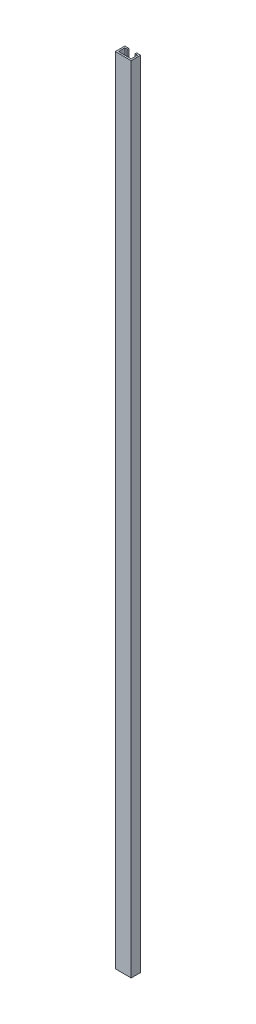
ISO-10303-21;
HEADER;
FILE_DESCRIPTION(('STEP AP214'),'2;1');
FILE_NAME('part.step','',(''),(''),'','','');
FILE_SCHEMA(('AUTOMOTIVE_DESIGN { 1 0 10303 214 1 1 1 1 }'));
ENDSEC;
DATA;
#1=APPLICATION_CONTEXT('core data for automotive mechanical design processes');
#2=APPLICATION_PROTOCOL_DEFINITION('international standard','automotive_design',2000,#1);
#3=PRODUCT_CONTEXT('',#1,'mechanical');
#4=PRODUCT('Part','Part','',(#3));
#5=PRODUCT_RELATED_PRODUCT_CATEGORY('part','',(#4));
#6=PRODUCT_DEFINITION_FORMATION('','',#4);
#7=PRODUCT_DEFINITION_CONTEXT('part definition',#1,'design');
#8=PRODUCT_DEFINITION('design','',#6,#7);
#9=PRODUCT_DEFINITION_SHAPE('','',#8);
#10=(LENGTH_UNIT() NAMED_UNIT(*) SI_UNIT(.MILLI.,.METRE.));
#11=(NAMED_UNIT(*) PLANE_ANGLE_UNIT() SI_UNIT($,.RADIAN.));
#12=(NAMED_UNIT(*) SI_UNIT($,.STERADIAN.) SOLID_ANGLE_UNIT());
#13=UNCERTAINTY_MEASURE_WITH_UNIT(LENGTH_MEASURE(1.E-05),#10,'distance_accuracy_value','');
#14=(GEOMETRIC_REPRESENTATION_CONTEXT(3) GLOBAL_UNCERTAINTY_ASSIGNED_CONTEXT((#13)) GLOBAL_UNIT_ASSIGNED_CONTEXT((#10,
#11,#12)) REPRESENTATION_CONTEXT('',''));
#15=CARTESIAN_POINT('',(0.,0.,0.));
#16=DIRECTION('',(0.,0.,1.));
#17=DIRECTION('',(1.,0.,0.));
#18=AXIS2_PLACEMENT_3D('',#15,#16,#17);
#19=CARTESIAN_POINT('',(0.,500.,0.));
#20=DIRECTION('',(1.,0.,0.));
#21=DIRECTION('',(0.,0.,-1.));
#22=AXIS2_PLACEMENT_3D('',#19,#20,#21);
#23=PLANE('',#22);
#24=DIRECTION('',(0.,0.,1.));
#25=VECTOR('',#24,1.);
#26=CARTESIAN_POINT('',(0.,0.,0.));
#27=LINE('',#26,#25);
#28=CARTESIAN_POINT('',(0.,0.,0.));
#29=VERTEX_POINT('',#28);
#30=CARTESIAN_POINT('',(0.,0.,6.));
#31=VERTEX_POINT('',#30);
#32=EDGE_CURVE('E157',#29,#31,#27,.T.);
#33=ORIENTED_EDGE('',*,*,#32,.T.);
#34=DIRECTION('',(0.,-1.,0.));
#35=VECTOR('',#34,1.);
#36=CARTESIAN_POINT('',(0.,500.,6.));
#37=LINE('',#36,#35);
#38=CARTESIAN_POINT('',(0.,500.,6.));
#39=VERTEX_POINT('',#38);
#40=EDGE_CURVE('E11',#39,#31,#37,.T.);
#41=ORIENTED_EDGE('',*,*,#40,.F.);
#42=DIRECTION('',(0.,0.,1.));
#43=VECTOR('',#42,1.);
#44=CARTESIAN_POINT('',(0.,500.,0.));
#45=LINE('',#44,#43);
#46=CARTESIAN_POINT('',(0.,500.,0.));
#47=VERTEX_POINT('',#46);
#48=EDGE_CURVE('E179',#47,#39,#45,.T.);
#49=ORIENTED_EDGE('',*,*,#48,.F.);
#50=DIRECTION('',(0.,-1.,0.));
#51=VECTOR('',#50,1.);
#52=CARTESIAN_POINT('',(0.,500.,0.));
#53=LINE('',#52,#51);
#54=EDGE_CURVE('E153',#47,#29,#53,.T.);
#55=ORIENTED_EDGE('',*,*,#54,.T.);
#56=EDGE_LOOP('',(#33,#41,#49,#55));
#57=FACE_BOUND('',#56,.T.);
#58=ADVANCED_FACE('F37',(#57),#23,.F.);
#59=CARTESIAN_POINT('',(0.,500.,6.));
#60=DIRECTION('',(0.,0.,-1.));
#61=DIRECTION('',(-1.,0.,0.));
#62=AXIS2_PLACEMENT_3D('',#59,#60,#61);
#63=PLANE('',#62);
#64=DIRECTION('',(1.,0.,0.));
#65=VECTOR('',#64,1.);
#66=CARTESIAN_POINT('',(0.,0.,6.));
#67=LINE('',#66,#65);
#68=CARTESIAN_POINT('',(10.,0.,6.));
#69=VERTEX_POINT('',#68);
#70=EDGE_CURVE('E160',#31,#69,#67,.T.);
#71=ORIENTED_EDGE('',*,*,#70,.T.);
#72=DIRECTION('',(0.,-1.,0.));
#73=VECTOR('',#72,1.);
#74=CARTESIAN_POINT('',(10.,500.,6.));
#75=LINE('',#74,#73);
#76=CARTESIAN_POINT('',(10.,500.,6.));
#77=VERTEX_POINT('',#76);
#78=EDGE_CURVE('E45',#77,#69,#75,.T.);
#79=ORIENTED_EDGE('',*,*,#78,.F.);
#80=DIRECTION('',(1.,0.,0.));
#81=VECTOR('',#80,1.);
#82=CARTESIAN_POINT('',(0.,500.,6.));
#83=LINE('',#82,#81);
#84=EDGE_CURVE('E108',#39,#77,#83,.T.);
#85=ORIENTED_EDGE('',*,*,#84,.F.);
#86=ORIENTED_EDGE('',*,*,#40,.T.);
#87=EDGE_LOOP('',(#71,#79,#85,#86));
#88=FACE_BOUND('',#87,.T.);
#89=ADVANCED_FACE('F257',(#88),#63,.F.);
#90=CARTESIAN_POINT('',(10.,500.,6.));
#91=DIRECTION('',(-1.,0.,0.));
#92=DIRECTION('',(0.,0.,1.));
#93=AXIS2_PLACEMENT_3D('',#90,#91,#92);
#94=PLANE('',#93);
#95=DIRECTION('',(0.,0.,-1.));
#96=VECTOR('',#95,1.);
#97=CARTESIAN_POINT('',(10.,0.,6.));
#98=LINE('',#97,#96);
#99=CARTESIAN_POINT('',(10.,0.,0.));
#100=VERTEX_POINT('',#99);
#101=EDGE_CURVE('E162',#69,#100,#98,.T.);
#102=ORIENTED_EDGE('',*,*,#101,.T.);
#103=DIRECTION('',(0.,-1.,0.));
#104=VECTOR('',#103,1.);
#105=CARTESIAN_POINT('',(10.,500.,0.));
#106=LINE('',#105,#104);
#107=CARTESIAN_POINT('',(10.,500.,0.));
#108=VERTEX_POINT('',#107);
#109=EDGE_CURVE('E198',#108,#100,#106,.T.);
#110=ORIENTED_EDGE('',*,*,#109,.F.);
#111=DIRECTION('',(0.,0.,-1.));
#112=VECTOR('',#111,1.);
#113=CARTESIAN_POINT('',(10.,500.,6.));
#114=LINE('',#113,#112);
#115=EDGE_CURVE('E206',#77,#108,#114,.T.);
#116=ORIENTED_EDGE('',*,*,#115,.F.);
#117=ORIENTED_EDGE('',*,*,#78,.T.);
#118=EDGE_LOOP('',(#102,#110,#116,#117));
#119=FACE_BOUND('',#118,.T.);
#120=ADVANCED_FACE('F204',(#119),#94,.F.);
#121=CARTESIAN_POINT('',(10.,500.,0.));
#122=DIRECTION('',(0.,0.,1.));
#123=DIRECTION('',(1.,0.,0.));
#124=AXIS2_PLACEMENT_3D('',#121,#122,#123);
#125=PLANE('',#124);
#126=DIRECTION('',(-1.,0.,0.));
#127=VECTOR('',#126,1.);
#128=CARTESIAN_POINT('',(10.,0.,0.));
#129=LINE('',#128,#127);
#130=CARTESIAN_POINT('',(7.5,0.,0.));
#131=VERTEX_POINT('',#130);
#132=EDGE_CURVE('E164',#100,#131,#129,.T.);
#133=ORIENTED_EDGE('',*,*,#132,.T.);
#134=DIRECTION('',(0.,-1.,0.));
#135=VECTOR('',#134,1.);
#136=CARTESIAN_POINT('',(7.5,500.,0.));
#137=LINE('',#136,#135);
#138=CARTESIAN_POINT('',(7.5,500.,0.));
#139=VERTEX_POINT('',#138);
#140=EDGE_CURVE('E195',#139,#131,#137,.T.);
#141=ORIENTED_EDGE('',*,*,#140,.F.);
#142=DIRECTION('',(-1.,0.,0.));
#143=VECTOR('',#142,1.);
#144=CARTESIAN_POINT('',(10.,500.,0.));
#145=LINE('',#144,#143);
#146=EDGE_CURVE('E224',#108,#139,#145,.T.);
#147=ORIENTED_EDGE('',*,*,#146,.F.);
#148=ORIENTED_EDGE('',*,*,#109,.T.);
#149=EDGE_LOOP('',(#133,#141,#147,#148));
#150=FACE_BOUND('',#149,.T.);
#151=ADVANCED_FACE('F215',(#150),#125,.F.);
#152=CARTESIAN_POINT('',(7.5,500.,0.));
#153=DIRECTION('',(1.,0.,0.));
#154=DIRECTION('',(0.,0.,-1.));
#155=AXIS2_PLACEMENT_3D('',#152,#153,#154);
#156=PLANE('',#155);
#157=DIRECTION('',(0.,0.,1.));
#158=VECTOR('',#157,1.);
#159=CARTESIAN_POINT('',(7.5,0.,0.));
#160=LINE('',#159,#158);
#161=CARTESIAN_POINT('',(7.5,0.,0.999999999999999));
#162=VERTEX_POINT('',#161);
#163=EDGE_CURVE('E166',#131,#162,#160,.T.);
#164=ORIENTED_EDGE('',*,*,#163,.T.);
#165=DIRECTION('',(0.,-1.,0.));
#166=VECTOR('',#165,1.);
#167=CARTESIAN_POINT('',(7.5,500.,0.999999999999999));
#168=LINE('',#167,#166);
#169=CARTESIAN_POINT('',(7.5,500.,0.999999999999999));
#170=VERTEX_POINT('',#169);
#171=EDGE_CURVE('E192',#170,#162,#168,.T.);
#172=ORIENTED_EDGE('',*,*,#171,.F.);
#173=DIRECTION('',(0.,0.,1.));
#174=VECTOR('',#173,1.);
#175=CARTESIAN_POINT('',(7.5,500.,0.));
#176=LINE('',#175,#174);
#177=EDGE_CURVE('E221',#139,#170,#176,.T.);
#178=ORIENTED_EDGE('',*,*,#177,.F.);
#179=ORIENTED_EDGE('',*,*,#140,.T.);
#180=EDGE_LOOP('',(#164,#172,#178,#179));
#181=FACE_BOUND('',#180,.T.);
#182=ADVANCED_FACE('F219',(#181),#156,.F.);
#183=CARTESIAN_POINT('',(7.5,500.,0.999999999999999));
#184=DIRECTION('',(0.,0.,-1.));
#185=DIRECTION('',(-1.,0.,0.));
#186=AXIS2_PLACEMENT_3D('',#183,#184,#185);
#187=PLANE('',#186);
#188=DIRECTION('',(1.,0.,0.));
#189=VECTOR('',#188,1.);
#190=CARTESIAN_POINT('',(7.5,0.,0.999999999999999));
#191=LINE('',#190,#189);
#192=CARTESIAN_POINT('',(9.,0.,0.999999999999999));
#193=VERTEX_POINT('',#192);
#194=EDGE_CURVE('E168',#162,#193,#191,.T.);
#195=ORIENTED_EDGE('',*,*,#194,.T.);
#196=DIRECTION('',(0.,-1.,0.));
#197=VECTOR('',#196,1.);
#198=CARTESIAN_POINT('',(9.,500.,0.999999999999999));
#199=LINE('',#198,#197);
#200=CARTESIAN_POINT('',(9.,500.,0.999999999999999));
#201=VERTEX_POINT('',#200);
#202=EDGE_CURVE('E189',#201,#193,#199,.T.);
#203=ORIENTED_EDGE('',*,*,#202,.F.);
#204=DIRECTION('',(1.,0.,0.));
#205=VECTOR('',#204,1.);
#206=CARTESIAN_POINT('',(7.5,500.,0.999999999999999));
#207=LINE('',#206,#205);
#208=EDGE_CURVE('E223',#170,#201,#207,.T.);
#209=ORIENTED_EDGE('',*,*,#208,.F.);
#210=ORIENTED_EDGE('',*,*,#171,.T.);
#211=EDGE_LOOP('',(#195,#203,#209,#210));
#212=FACE_BOUND('',#211,.T.);
#213=ADVANCED_FACE('F270',(#212),#187,.F.);
#214=CARTESIAN_POINT('',(9.,500.,0.999999999999999));
#215=DIRECTION('',(1.,0.,0.));
#216=DIRECTION('',(0.,0.,-1.));
#217=AXIS2_PLACEMENT_3D('',#214,#215,#216);
#218=PLANE('',#217);
#219=DIRECTION('',(0.,0.,1.));
#220=VECTOR('',#219,1.);
#221=CARTESIAN_POINT('',(9.,0.,0.999999999999999));
#222=LINE('',#221,#220);
#223=CARTESIAN_POINT('',(9.,0.,5.));
#224=VERTEX_POINT('',#223);
#225=EDGE_CURVE('E170',#193,#224,#222,.T.);
#226=ORIENTED_EDGE('',*,*,#225,.T.);
#227=DIRECTION('',(0.,-1.,0.));
#228=VECTOR('',#227,1.);
#229=CARTESIAN_POINT('',(9.,500.,5.));
#230=LINE('',#229,#228);
#231=CARTESIAN_POINT('',(9.,500.,5.));
#232=VERTEX_POINT('',#231);
#233=EDGE_CURVE('E186',#232,#224,#230,.T.);
#234=ORIENTED_EDGE('',*,*,#233,.F.);
#235=DIRECTION('',(0.,0.,1.));
#236=VECTOR('',#235,1.);
#237=CARTESIAN_POINT('',(9.,500.,0.999999999999999));
#238=LINE('',#237,#236);
#239=EDGE_CURVE('E226',#201,#232,#238,.T.);
#240=ORIENTED_EDGE('',*,*,#239,.F.);
#241=ORIENTED_EDGE('',*,*,#202,.T.);
#242=EDGE_LOOP('',(#226,#234,#240,#241));
#243=FACE_BOUND('',#242,.T.);
#244=ADVANCED_FACE('F273',(#243),#218,.F.);
#245=CARTESIAN_POINT('',(9.,500.,5.));
#246=DIRECTION('',(0.,0.,1.));
#247=DIRECTION('',(1.,0.,0.));
#248=AXIS2_PLACEMENT_3D('',#245,#246,#247);
#249=PLANE('',#248);
#250=DIRECTION('',(-1.,0.,0.));
#251=VECTOR('',#250,1.);
#252=CARTESIAN_POINT('',(9.,0.,5.));
#253=LINE('',#252,#251);
#254=CARTESIAN_POINT('',(1.,0.,5.));
#255=VERTEX_POINT('',#254);
#256=EDGE_CURVE('E172',#224,#255,#253,.T.);
#257=ORIENTED_EDGE('',*,*,#256,.T.);
#258=DIRECTION('',(0.,-1.,0.));
#259=VECTOR('',#258,1.);
#260=CARTESIAN_POINT('',(1.,500.,5.));
#261=LINE('',#260,#259);
#262=CARTESIAN_POINT('',(1.,500.,5.));
#263=VERTEX_POINT('',#262);
#264=EDGE_CURVE('E183',#263,#255,#261,.T.);
#265=ORIENTED_EDGE('',*,*,#264,.F.);
#266=DIRECTION('',(-1.,0.,0.));
#267=VECTOR('',#266,1.);
#268=CARTESIAN_POINT('',(9.,500.,5.));
#269=LINE('',#268,#267);
#270=EDGE_CURVE('E232',#232,#263,#269,.T.);
#271=ORIENTED_EDGE('',*,*,#270,.F.);
#272=ORIENTED_EDGE('',*,*,#233,.T.);
#273=EDGE_LOOP('',(#257,#265,#271,#272));
#274=FACE_BOUND('',#273,.T.);
#275=ADVANCED_FACE('F238',(#274),#249,.F.);
#276=CARTESIAN_POINT('',(1.,500.,5.));
#277=DIRECTION('',(-1.,0.,0.));
#278=DIRECTION('',(0.,0.,1.));
#279=AXIS2_PLACEMENT_3D('',#276,#277,#278);
#280=PLANE('',#279);
#281=DIRECTION('',(0.,0.,-1.));
#282=VECTOR('',#281,1.);
#283=CARTESIAN_POINT('',(1.,0.,5.));
#284=LINE('',#283,#282);
#285=CARTESIAN_POINT('',(1.,0.,1.));
#286=VERTEX_POINT('',#285);
#287=EDGE_CURVE('E174',#255,#286,#284,.T.);
#288=ORIENTED_EDGE('',*,*,#287,.T.);
#289=DIRECTION('',(0.,-1.,0.));
#290=VECTOR('',#289,1.);
#291=CARTESIAN_POINT('',(1.,500.,1.));
#292=LINE('',#291,#290);
#293=CARTESIAN_POINT('',(1.,500.,1.));
#294=VERTEX_POINT('',#293);
#295=EDGE_CURVE('E148',#294,#286,#292,.T.);
#296=ORIENTED_EDGE('',*,*,#295,.F.);
#297=DIRECTION('',(0.,0.,-1.));
#298=VECTOR('',#297,1.);
#299=CARTESIAN_POINT('',(1.,500.,5.));
#300=LINE('',#299,#298);
#301=EDGE_CURVE('E139',#263,#294,#300,.T.);
#302=ORIENTED_EDGE('',*,*,#301,.F.);
#303=ORIENTED_EDGE('',*,*,#264,.T.);
#304=EDGE_LOOP('',(#288,#296,#302,#303));
#305=FACE_BOUND('',#304,.T.);
#306=ADVANCED_FACE('F242',(#305),#280,.F.);
#307=CARTESIAN_POINT('',(1.,500.,1.));
#308=DIRECTION('',(0.,0.,-1.));
#309=DIRECTION('',(-1.,0.,0.));
#310=AXIS2_PLACEMENT_3D('',#307,#308,#309);
#311=PLANE('',#310);
#312=DIRECTION('',(1.,0.,0.));
#313=VECTOR('',#312,1.);
#314=CARTESIAN_POINT('',(1.,0.,1.));
#315=LINE('',#314,#313);
#316=CARTESIAN_POINT('',(2.5,0.,1.));
#317=VERTEX_POINT('',#316);
#318=EDGE_CURVE('E147',#286,#317,#315,.T.);
#319=ORIENTED_EDGE('',*,*,#318,.T.);
#320=DIRECTION('',(0.,-1.,0.));
#321=VECTOR('',#320,1.);
#322=CARTESIAN_POINT('',(2.5,500.,1.));
#323=LINE('',#322,#321);
#324=CARTESIAN_POINT('',(2.5,500.,1.));
#325=VERTEX_POINT('',#324);
#326=EDGE_CURVE('E144',#325,#317,#323,.T.);
#327=ORIENTED_EDGE('',*,*,#326,.F.);
#328=DIRECTION('',(1.,0.,0.));
#329=VECTOR('',#328,1.);
#330=CARTESIAN_POINT('',(1.,500.,1.));
#331=LINE('',#330,#329);
#332=EDGE_CURVE('E133',#294,#325,#331,.T.);
#333=ORIENTED_EDGE('',*,*,#332,.F.);
#334=ORIENTED_EDGE('',*,*,#295,.T.);
#335=EDGE_LOOP('',(#319,#327,#333,#334));
#336=FACE_BOUND('',#335,.T.);
#337=ADVANCED_FACE('F145',(#336),#311,.F.);
#338=CARTESIAN_POINT('',(2.5,500.,1.));
#339=DIRECTION('',(-1.,0.,0.));
#340=DIRECTION('',(0.,0.,1.));
#341=AXIS2_PLACEMENT_3D('',#338,#339,#340);
#342=PLANE('',#341);
#343=DIRECTION('',(0.,0.,-1.));
#344=VECTOR('',#343,1.);
#345=CARTESIAN_POINT('',(2.5,0.,1.));
#346=LINE('',#345,#344);
#347=CARTESIAN_POINT('',(2.5,0.,0.));
#348=VERTEX_POINT('',#347);
#349=EDGE_CURVE('E94',#317,#348,#346,.T.);
#350=ORIENTED_EDGE('',*,*,#349,.T.);
#351=DIRECTION('',(0.,-1.,0.));
#352=VECTOR('',#351,1.);
#353=CARTESIAN_POINT('',(2.5,500.,0.));
#354=LINE('',#353,#352);
#355=CARTESIAN_POINT('',(2.5,500.,0.));
#356=VERTEX_POINT('',#355);
#357=EDGE_CURVE('E149',#356,#348,#354,.T.);
#358=ORIENTED_EDGE('',*,*,#357,.F.);
#359=DIRECTION('',(0.,0.,-1.));
#360=VECTOR('',#359,1.);
#361=CARTESIAN_POINT('',(2.5,500.,1.));
#362=LINE('',#361,#360);
#363=EDGE_CURVE('E137',#325,#356,#362,.T.);
#364=ORIENTED_EDGE('',*,*,#363,.F.);
#365=ORIENTED_EDGE('',*,*,#326,.T.);
#366=EDGE_LOOP('',(#350,#358,#364,#365));
#367=FACE_BOUND('',#366,.T.);
#368=ADVANCED_FACE('F151',(#367),#342,.F.);
#369=CARTESIAN_POINT('',(2.5,500.,0.));
#370=DIRECTION('',(0.,0.,1.));
#371=DIRECTION('',(1.,0.,0.));
#372=AXIS2_PLACEMENT_3D('',#369,#370,#371);
#373=PLANE('',#372);
#374=DIRECTION('',(-1.,0.,0.));
#375=VECTOR('',#374,1.);
#376=CARTESIAN_POINT('',(2.5,0.,0.));
#377=LINE('',#376,#375);
#378=EDGE_CURVE('E100',#348,#29,#377,.T.);
#379=ORIENTED_EDGE('',*,*,#378,.T.);
#380=ORIENTED_EDGE('',*,*,#54,.F.);
#381=DIRECTION('',(-1.,0.,0.));
#382=VECTOR('',#381,1.);
#383=CARTESIAN_POINT('',(2.5,500.,0.));
#384=LINE('',#383,#382);
#385=EDGE_CURVE('E53',#356,#47,#384,.T.);
#386=ORIENTED_EDGE('',*,*,#385,.F.);
#387=ORIENTED_EDGE('',*,*,#357,.T.);
#388=EDGE_LOOP('',(#379,#380,#386,#387));
#389=FACE_BOUND('',#388,.T.);
#390=ADVANCED_FACE('F246',(#389),#373,.F.);
#391=CARTESIAN_POINT('',(0.,500.,0.));
#392=DIRECTION('',(0.,1.,0.));
#393=DIRECTION('',(0.,0.,1.));
#394=AXIS2_PLACEMENT_3D('',#391,#392,#393);
#395=PLANE('',#394);
#396=ORIENTED_EDGE('',*,*,#48,.T.);
#397=ORIENTED_EDGE('',*,*,#84,.T.);
#398=ORIENTED_EDGE('',*,*,#115,.T.);
#399=ORIENTED_EDGE('',*,*,#146,.T.);
#400=ORIENTED_EDGE('',*,*,#177,.T.);
#401=ORIENTED_EDGE('',*,*,#208,.T.);
#402=ORIENTED_EDGE('',*,*,#239,.T.);
#403=ORIENTED_EDGE('',*,*,#270,.T.);
#404=ORIENTED_EDGE('',*,*,#301,.T.);
#405=ORIENTED_EDGE('',*,*,#332,.T.);
#406=ORIENTED_EDGE('',*,*,#363,.T.);
#407=ORIENTED_EDGE('',*,*,#385,.T.);
#408=EDGE_LOOP('',(#396,#397,#398,#399,#400,#401,#402,#403,#404,#405,#406,#407));
#409=FACE_BOUND('',#408,.T.);
#410=ADVANCED_FACE('F135',(#409),#395,.T.);
#411=CARTESIAN_POINT('',(0.,0.,0.));
#412=DIRECTION('',(0.,1.,0.));
#413=DIRECTION('',(0.,0.,1.));
#414=AXIS2_PLACEMENT_3D('',#411,#412,#413);
#415=PLANE('',#414);
#416=ORIENTED_EDGE('',*,*,#32,.F.);
#417=ORIENTED_EDGE('',*,*,#378,.F.);
#418=ORIENTED_EDGE('',*,*,#349,.F.);
#419=ORIENTED_EDGE('',*,*,#318,.F.);
#420=ORIENTED_EDGE('',*,*,#287,.F.);
#421=ORIENTED_EDGE('',*,*,#256,.F.);
#422=ORIENTED_EDGE('',*,*,#225,.F.);
#423=ORIENTED_EDGE('',*,*,#194,.F.);
#424=ORIENTED_EDGE('',*,*,#163,.F.);
#425=ORIENTED_EDGE('',*,*,#132,.F.);
#426=ORIENTED_EDGE('',*,*,#101,.F.);
#427=ORIENTED_EDGE('',*,*,#70,.F.);
#428=EDGE_LOOP('',(#416,#417,#418,#419,#420,#421,#422,#423,#424,#425,#426,#427));
#429=FACE_BOUND('',#428,.T.);
#430=ADVANCED_FACE('F210',(#429),#415,.F.);
#431=CLOSED_SHELL('',(#58,#89,#120,#151,#182,#213,#244,#275,#306,#337,#368,#390,#410,#430));
#432=MANIFOLD_SOLID_BREP('B2',#431);
#433=ADVANCED_BREP_SHAPE_REPRESENTATION('',(#18,#432),#14);
#434=SHAPE_DEFINITION_REPRESENTATION(#9,#433);
ENDSEC;
END-ISO-10303-21;
